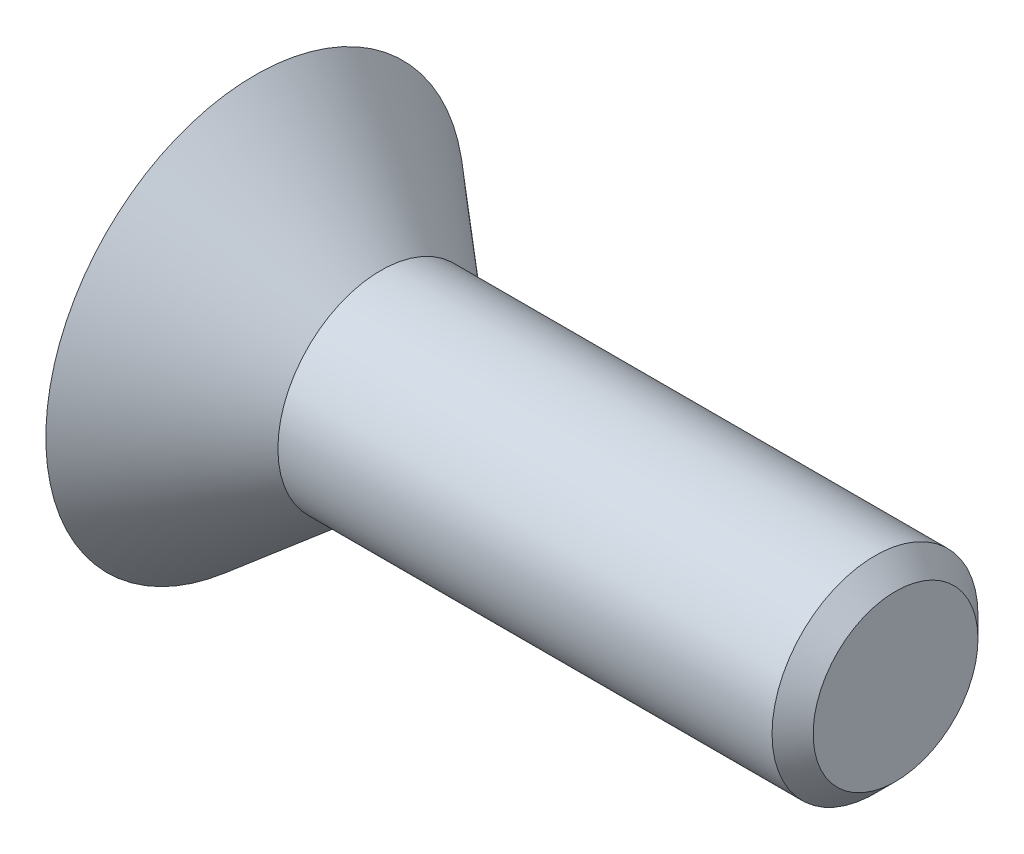
ISO-10303-21;
HEADER;
FILE_DESCRIPTION(('STEP AP214'),'2;1');
FILE_NAME('part.step','',(''),(''),'','','');
FILE_SCHEMA(('AUTOMOTIVE_DESIGN { 1 0 10303 214 1 1 1 1 }'));
ENDSEC;
DATA;
#1=APPLICATION_CONTEXT('core data for automotive mechanical design processes');
#2=APPLICATION_PROTOCOL_DEFINITION('international standard','automotive_design',2000,#1);
#3=PRODUCT_CONTEXT('',#1,'mechanical');
#4=PRODUCT('Part','Part','',(#3));
#5=PRODUCT_RELATED_PRODUCT_CATEGORY('part','',(#4));
#6=PRODUCT_DEFINITION_FORMATION('','',#4);
#7=PRODUCT_DEFINITION_CONTEXT('part definition',#1,'design');
#8=PRODUCT_DEFINITION('design','',#6,#7);
#9=PRODUCT_DEFINITION_SHAPE('','',#8);
#10=(LENGTH_UNIT() NAMED_UNIT(*) SI_UNIT(.MILLI.,.METRE.));
#11=(NAMED_UNIT(*) PLANE_ANGLE_UNIT() SI_UNIT($,.RADIAN.));
#12=(NAMED_UNIT(*) SI_UNIT($,.STERADIAN.) SOLID_ANGLE_UNIT());
#13=UNCERTAINTY_MEASURE_WITH_UNIT(LENGTH_MEASURE(1.E-05),#10,'distance_accuracy_value','');
#14=(GEOMETRIC_REPRESENTATION_CONTEXT(3) GLOBAL_UNCERTAINTY_ASSIGNED_CONTEXT((#13)) GLOBAL_UNIT_ASSIGNED_CONTEXT((#10,
#11,#12)) REPRESENTATION_CONTEXT('',''));
#15=CARTESIAN_POINT('',(0.,0.,0.));
#16=DIRECTION('',(0.,0.,1.));
#17=DIRECTION('',(1.,0.,0.));
#18=AXIS2_PLACEMENT_3D('',#15,#16,#17);
#19=CARTESIAN_POINT('',(498.7671,265.527536,0.));
#20=DIRECTION('',(-1.,0.,0.));
#21=DIRECTION('',(0.,0.,1.));
#22=AXIS2_PLACEMENT_3D('',#19,#20,#21);
#23=PLANE('',#22);
#24=CARTESIAN_POINT('',(498.7671,265.527536,0.));
#25=DIRECTION('',(1.,0.,0.));
#26=DIRECTION('',(0.,0.,-1.));
#27=AXIS2_PLACEMENT_3D('',#24,#25,#26);
#28=CIRCLE('',#27,8.06462699999999);
#29=CARTESIAN_POINT('',(498.7671,265.527536,-8.06462699999999));
#30=VERTEX_POINT('',#29);
#31=EDGE_CURVE('E11',#30,#30,#28,.T.);
#32=ORIENTED_EDGE('',*,*,#31,.F.);
#33=EDGE_LOOP('',(#32));
#34=FACE_BOUND('',#33,.T.);
#35=DIRECTION('',(0.,0.,1.));
#36=VECTOR('',#35,1.);
#37=CARTESIAN_POINT('',(498.7671,264.527536,0.));
#38=LINE('',#37,#36);
#39=CARTESIAN_POINT('',(498.7671,264.527536,1.));
#40=VERTEX_POINT('',#39);
#41=CARTESIAN_POINT('',(498.7671,264.527536,6.));
#42=VERTEX_POINT('',#41);
#43=EDGE_CURVE('E156',#40,#42,#38,.T.);
#44=ORIENTED_EDGE('',*,*,#43,.F.);
#45=DIRECTION('',(0.,-1.,0.));
#46=VECTOR('',#45,1.);
#47=CARTESIAN_POINT('',(498.7671,247.643935243763,1.));
#48=LINE('',#47,#46);
#49=CARTESIAN_POINT('',(498.7671,259.527536,1.));
#50=VERTEX_POINT('',#49);
#51=EDGE_CURVE('E47',#40,#50,#48,.T.);
#52=ORIENTED_EDGE('',*,*,#51,.T.);
#53=DIRECTION('',(0.,0.,1.));
#54=VECTOR('',#53,1.);
#55=CARTESIAN_POINT('',(498.7671,259.527536,0.));
#56=LINE('',#55,#54);
#57=CARTESIAN_POINT('',(498.7671,259.527536,-0.999999999999998));
#58=VERTEX_POINT('',#57);
#59=EDGE_CURVE('E183',#58,#50,#56,.T.);
#60=ORIENTED_EDGE('',*,*,#59,.F.);
#61=DIRECTION('',(0.,-1.,0.));
#62=VECTOR('',#61,1.);
#63=CARTESIAN_POINT('',(498.7671,247.643935243763,-0.999999999999997));
#64=LINE('',#63,#62);
#65=CARTESIAN_POINT('',(498.7671,264.527536,-0.999999999999999));
#66=VERTEX_POINT('',#65);
#67=EDGE_CURVE('E181',#66,#58,#64,.T.);
#68=ORIENTED_EDGE('',*,*,#67,.F.);
#69=DIRECTION('',(0.,0.,1.));
#70=VECTOR('',#69,1.);
#71=CARTESIAN_POINT('',(498.7671,264.527536,0.));
#72=LINE('',#71,#70);
#73=CARTESIAN_POINT('',(498.7671,264.527536,-6.));
#74=VERTEX_POINT('',#73);
#75=EDGE_CURVE('E130',#74,#66,#72,.T.);
#76=ORIENTED_EDGE('',*,*,#75,.F.);
#77=DIRECTION('',(0.,-1.,0.));
#78=VECTOR('',#77,1.);
#79=CARTESIAN_POINT('',(498.7671,247.643935243763,-6.));
#80=LINE('',#79,#78);
#81=CARTESIAN_POINT('',(498.7671,266.527536,-6.));
#82=VERTEX_POINT('',#81);
#83=EDGE_CURVE('E177',#82,#74,#80,.T.);
#84=ORIENTED_EDGE('',*,*,#83,.F.);
#85=DIRECTION('',(0.,0.,1.));
#86=VECTOR('',#85,1.);
#87=CARTESIAN_POINT('',(498.7671,266.527536,0.));
#88=LINE('',#87,#86);
#89=CARTESIAN_POINT('',(498.7671,266.527536,-0.999999999999999));
#90=VERTEX_POINT('',#89);
#91=EDGE_CURVE('E174',#82,#90,#88,.T.);
#92=ORIENTED_EDGE('',*,*,#91,.T.);
#93=DIRECTION('',(0.,-1.,0.));
#94=VECTOR('',#93,1.);
#95=CARTESIAN_POINT('',(498.7671,247.643935243763,-0.999999999999997));
#96=LINE('',#95,#94);
#97=CARTESIAN_POINT('',(498.7671,271.527536,-1.));
#98=VERTEX_POINT('',#97);
#99=EDGE_CURVE('E171',#98,#90,#96,.T.);
#100=ORIENTED_EDGE('',*,*,#99,.F.);
#101=DIRECTION('',(0.,0.,1.));
#102=VECTOR('',#101,1.);
#103=CARTESIAN_POINT('',(498.7671,271.527536,0.));
#104=LINE('',#103,#102);
#105=CARTESIAN_POINT('',(498.7671,271.527536,1.));
#106=VERTEX_POINT('',#105);
#107=EDGE_CURVE('E168',#98,#106,#104,.T.);
#108=ORIENTED_EDGE('',*,*,#107,.T.);
#109=DIRECTION('',(0.,-1.,0.));
#110=VECTOR('',#109,1.);
#111=CARTESIAN_POINT('',(498.7671,247.643935243763,1.));
#112=LINE('',#111,#110);
#113=CARTESIAN_POINT('',(498.7671,266.527536,1.));
#114=VERTEX_POINT('',#113);
#115=EDGE_CURVE('E165',#106,#114,#112,.T.);
#116=ORIENTED_EDGE('',*,*,#115,.T.);
#117=DIRECTION('',(0.,0.,1.));
#118=VECTOR('',#117,1.);
#119=CARTESIAN_POINT('',(498.7671,266.527536,0.));
#120=LINE('',#119,#118);
#121=CARTESIAN_POINT('',(498.7671,266.527536,6.));
#122=VERTEX_POINT('',#121);
#123=EDGE_CURVE('E162',#114,#122,#120,.T.);
#124=ORIENTED_EDGE('',*,*,#123,.T.);
#125=DIRECTION('',(0.,-1.,0.));
#126=VECTOR('',#125,1.);
#127=CARTESIAN_POINT('',(498.7671,247.643935243763,6.00000000000001));
#128=LINE('',#127,#126);
#129=EDGE_CURVE('E159',#122,#42,#128,.T.);
#130=ORIENTED_EDGE('',*,*,#129,.T.);
#131=EDGE_LOOP('',(#44,#52,#60,#68,#76,#84,#92,#100,#108,#116,#124,#130));
#132=FACE_BOUND('',#131,.T.);
#133=ADVANCED_FACE('F33',(#34,#132),#23,.T.);
#134=CARTESIAN_POINT('',(503.618754,265.527536,0.));
#135=DIRECTION('',(-1.,0.,0.));
#136=DIRECTION('',(0.,0.,1.));
#137=AXIS2_PLACEMENT_3D('',#134,#135,#136);
#138=CONICAL_SURFACE('',#137,3.969893,0.700992965111043);
#139=ORIENTED_EDGE('',*,*,#31,.T.);
#140=EDGE_LOOP('',(#139));
#141=FACE_BOUND('',#140,.T.);
#142=CARTESIAN_POINT('',(503.618754,265.527536,0.));
#143=DIRECTION('',(1.,0.,0.));
#144=DIRECTION('',(0.,0.,-1.));
#145=AXIS2_PLACEMENT_3D('',#142,#143,#144);
#146=CIRCLE('',#145,3.969893);
#147=CARTESIAN_POINT('',(503.618754,265.527536,-3.969893));
#148=VERTEX_POINT('',#147);
#149=EDGE_CURVE('E40',#148,#148,#146,.T.);
#150=ORIENTED_EDGE('',*,*,#149,.F.);
#151=EDGE_LOOP('',(#150));
#152=FACE_BOUND('',#151,.T.);
#153=ADVANCED_FACE('F214',(#141,#152),#138,.T.);
#154=CARTESIAN_POINT('',(523.461488,265.527536,0.));
#155=DIRECTION('',(1.,0.,0.));
#156=DIRECTION('',(0.,0.,-1.));
#157=AXIS2_PLACEMENT_3D('',#154,#155,#156);
#158=CYLINDRICAL_SURFACE('',#157,3.969893);
#159=ORIENTED_EDGE('',*,*,#149,.T.);
#160=EDGE_LOOP('',(#159));
#161=FACE_BOUND('',#160,.T.);
#162=CARTESIAN_POINT('',(522.668754,265.527536,0.));
#163=DIRECTION('',(1.,0.,0.));
#164=DIRECTION('',(0.,0.,-1.));
#165=AXIS2_PLACEMENT_3D('',#162,#163,#164);
#166=CIRCLE('',#165,3.969893);
#167=CARTESIAN_POINT('',(522.668754,265.527536,-3.969893));
#168=VERTEX_POINT('',#167);
#169=EDGE_CURVE('E206',#168,#168,#166,.T.);
#170=ORIENTED_EDGE('',*,*,#169,.F.);
#171=EDGE_LOOP('',(#170));
#172=FACE_BOUND('',#171,.T.);
#173=ADVANCED_FACE('F211',(#161,#172),#158,.T.);
#174=CARTESIAN_POINT('',(523.461488,265.527536,0.));
#175=DIRECTION('',(-1.,0.,0.));
#176=DIRECTION('',(0.,0.,1.));
#177=AXIS2_PLACEMENT_3D('',#174,#175,#176);
#178=CONICAL_SURFACE('',#177,3.17766700000005,0.785077650587939);
#179=ORIENTED_EDGE('',*,*,#169,.T.);
#180=EDGE_LOOP('',(#179));
#181=FACE_BOUND('',#180,.T.);
#182=CARTESIAN_POINT('',(523.461488,265.527536,0.));
#183=DIRECTION('',(1.,0.,0.));
#184=DIRECTION('',(0.,0.,-1.));
#185=AXIS2_PLACEMENT_3D('',#182,#183,#184);
#186=CIRCLE('',#185,3.17766700000005);
#187=CARTESIAN_POINT('',(523.461488,265.527536,-3.17766700000005));
#188=VERTEX_POINT('',#187);
#189=EDGE_CURVE('E186',#188,#188,#186,.T.);
#190=ORIENTED_EDGE('',*,*,#189,.F.);
#191=EDGE_LOOP('',(#190));
#192=FACE_BOUND('',#191,.T.);
#193=ADVANCED_FACE('F221',(#181,#192),#178,.T.);
#194=CARTESIAN_POINT('',(523.461488,268.705203,0.));
#195=DIRECTION('',(1.,0.,0.));
#196=DIRECTION('',(0.,0.,-1.));
#197=AXIS2_PLACEMENT_3D('',#194,#195,#196);
#198=PLANE('',#197);
#199=ORIENTED_EDGE('',*,*,#189,.T.);
#200=EDGE_LOOP('',(#199));
#201=FACE_BOUND('',#200,.T.);
#202=ADVANCED_FACE('F227',(#201),#198,.T.);
#203=CARTESIAN_POINT('',(500.7671,247.643935243763,1.));
#204=DIRECTION('',(0.,0.,-1.));
#205=DIRECTION('',(0.,1.,0.));
#206=AXIS2_PLACEMENT_3D('',#203,#204,#205);
#207=PLANE('',#206);
#208=ORIENTED_EDGE('',*,*,#51,.F.);
#209=DIRECTION('',(-1.,0.,0.));
#210=VECTOR('',#209,1.);
#211=CARTESIAN_POINT('',(500.7671,264.527536,1.));
#212=LINE('',#211,#210);
#213=CARTESIAN_POINT('',(500.7671,264.527536,1.));
#214=VERTEX_POINT('',#213);
#215=EDGE_CURVE('E95',#214,#40,#212,.T.);
#216=ORIENTED_EDGE('',*,*,#215,.F.);
#217=DIRECTION('',(0.,-1.,0.));
#218=VECTOR('',#217,1.);
#219=CARTESIAN_POINT('',(500.7671,247.643935243763,1.));
#220=LINE('',#219,#218);
#221=CARTESIAN_POINT('',(500.7671,259.527536,1.));
#222=VERTEX_POINT('',#221);
#223=EDGE_CURVE('E53',#214,#222,#220,.T.);
#224=ORIENTED_EDGE('',*,*,#223,.T.);
#225=DIRECTION('',(-1.,0.,0.));
#226=VECTOR('',#225,1.);
#227=CARTESIAN_POINT('',(500.7671,259.527536,1.));
#228=LINE('',#227,#226);
#229=EDGE_CURVE('E91',#222,#50,#228,.T.);
#230=ORIENTED_EDGE('',*,*,#229,.T.);
#231=EDGE_LOOP('',(#208,#216,#224,#230));
#232=FACE_BOUND('',#231,.T.);
#233=ADVANCED_FACE('F231',(#232),#207,.T.);
#234=CARTESIAN_POINT('',(500.7671,259.527536,0.));
#235=DIRECTION('',(0.,-1.,0.));
#236=DIRECTION('',(0.,0.,-1.));
#237=AXIS2_PLACEMENT_3D('',#234,#235,#236);
#238=PLANE('',#237);
#239=ORIENTED_EDGE('',*,*,#59,.T.);
#240=ORIENTED_EDGE('',*,*,#229,.F.);
#241=DIRECTION('',(0.,0.,1.));
#242=VECTOR('',#241,1.);
#243=CARTESIAN_POINT('',(500.7671,259.527536,0.));
#244=LINE('',#243,#242);
#245=CARTESIAN_POINT('',(500.7671,259.527536,-0.999999999999998));
#246=VERTEX_POINT('',#245);
#247=EDGE_CURVE('E143',#246,#222,#244,.T.);
#248=ORIENTED_EDGE('',*,*,#247,.F.);
#249=DIRECTION('',(-1.,0.,0.));
#250=VECTOR('',#249,1.);
#251=CARTESIAN_POINT('',(500.7671,259.527536,-0.999999999999998));
#252=LINE('',#251,#250);
#253=EDGE_CURVE('E134',#246,#58,#252,.T.);
#254=ORIENTED_EDGE('',*,*,#253,.T.);
#255=EDGE_LOOP('',(#239,#240,#248,#254));
#256=FACE_BOUND('',#255,.T.);
#257=ADVANCED_FACE('F235',(#256),#238,.F.);
#258=CARTESIAN_POINT('',(500.7671,247.643935243763,-0.999999999999997));
#259=DIRECTION('',(0.,0.,-1.));
#260=DIRECTION('',(0.,1.,0.));
#261=AXIS2_PLACEMENT_3D('',#258,#259,#260);
#262=PLANE('',#261);
#263=ORIENTED_EDGE('',*,*,#67,.T.);
#264=ORIENTED_EDGE('',*,*,#253,.F.);
#265=DIRECTION('',(0.,-1.,0.));
#266=VECTOR('',#265,1.);
#267=CARTESIAN_POINT('',(500.7671,247.643935243763,-0.999999999999997));
#268=LINE('',#267,#266);
#269=CARTESIAN_POINT('',(500.7671,264.527536,-0.999999999999999));
#270=VERTEX_POINT('',#269);
#271=EDGE_CURVE('E138',#270,#246,#268,.T.);
#272=ORIENTED_EDGE('',*,*,#271,.F.);
#273=DIRECTION('',(-1.,0.,0.));
#274=VECTOR('',#273,1.);
#275=CARTESIAN_POINT('',(500.7671,264.527536,-0.999999999999999));
#276=LINE('',#275,#274);
#277=EDGE_CURVE('E123',#270,#66,#276,.T.);
#278=ORIENTED_EDGE('',*,*,#277,.T.);
#279=EDGE_LOOP('',(#263,#264,#272,#278));
#280=FACE_BOUND('',#279,.T.);
#281=ADVANCED_FACE('F139',(#280),#262,.F.);
#282=CARTESIAN_POINT('',(500.7671,264.527536,0.));
#283=DIRECTION('',(0.,-1.,0.));
#284=DIRECTION('',(0.,0.,-1.));
#285=AXIS2_PLACEMENT_3D('',#282,#283,#284);
#286=PLANE('',#285);
#287=ORIENTED_EDGE('',*,*,#75,.T.);
#288=ORIENTED_EDGE('',*,*,#277,.F.);
#289=DIRECTION('',(0.,0.,1.));
#290=VECTOR('',#289,1.);
#291=CARTESIAN_POINT('',(500.7671,264.527536,0.));
#292=LINE('',#291,#290);
#293=CARTESIAN_POINT('',(500.7671,264.527536,-6.));
#294=VERTEX_POINT('',#293);
#295=EDGE_CURVE('E127',#294,#270,#292,.T.);
#296=ORIENTED_EDGE('',*,*,#295,.F.);
#297=DIRECTION('',(-1.,0.,0.));
#298=VECTOR('',#297,1.);
#299=CARTESIAN_POINT('',(500.7671,264.527536,-6.));
#300=LINE('',#299,#298);
#301=EDGE_CURVE('E135',#294,#74,#300,.T.);
#302=ORIENTED_EDGE('',*,*,#301,.T.);
#303=EDGE_LOOP('',(#287,#288,#296,#302));
#304=FACE_BOUND('',#303,.T.);
#305=ADVANCED_FACE('F125',(#304),#286,.F.);
#306=CARTESIAN_POINT('',(500.7671,247.643935243763,-6.));
#307=DIRECTION('',(0.,0.,-1.));
#308=DIRECTION('',(-1.,0.,0.));
#309=AXIS2_PLACEMENT_3D('',#306,#307,#308);
#310=PLANE('',#309);
#311=ORIENTED_EDGE('',*,*,#83,.T.);
#312=ORIENTED_EDGE('',*,*,#301,.F.);
#313=DIRECTION('',(0.,-1.,0.));
#314=VECTOR('',#313,1.);
#315=CARTESIAN_POINT('',(500.7671,247.643935243763,-6.));
#316=LINE('',#315,#314);
#317=CARTESIAN_POINT('',(500.7671,266.527536,-6.));
#318=VERTEX_POINT('',#317);
#319=EDGE_CURVE('E148',#318,#294,#316,.T.);
#320=ORIENTED_EDGE('',*,*,#319,.F.);
#321=DIRECTION('',(-1.,0.,0.));
#322=VECTOR('',#321,1.);
#323=CARTESIAN_POINT('',(500.7671,266.527536,-6.));
#324=LINE('',#323,#322);
#325=EDGE_CURVE('E189',#318,#82,#324,.T.);
#326=ORIENTED_EDGE('',*,*,#325,.T.);
#327=EDGE_LOOP('',(#311,#312,#320,#326));
#328=FACE_BOUND('',#327,.T.);
#329=ADVANCED_FACE('F263',(#328),#310,.F.);
#330=CARTESIAN_POINT('',(500.7671,266.527536,0.));
#331=DIRECTION('',(0.,-1.,0.));
#332=DIRECTION('',(0.,0.,-1.));
#333=AXIS2_PLACEMENT_3D('',#330,#331,#332);
#334=PLANE('',#333);
#335=ORIENTED_EDGE('',*,*,#91,.F.);
#336=ORIENTED_EDGE('',*,*,#325,.F.);
#337=DIRECTION('',(0.,0.,1.));
#338=VECTOR('',#337,1.);
#339=CARTESIAN_POINT('',(500.7671,266.527536,0.));
#340=LINE('',#339,#338);
#341=CARTESIAN_POINT('',(500.7671,266.527536,-0.999999999999999));
#342=VERTEX_POINT('',#341);
#343=EDGE_CURVE('E150',#318,#342,#340,.T.);
#344=ORIENTED_EDGE('',*,*,#343,.T.);
#345=DIRECTION('',(-1.,0.,0.));
#346=VECTOR('',#345,1.);
#347=CARTESIAN_POINT('',(500.7671,266.527536,-0.999999999999999));
#348=LINE('',#347,#346);
#349=EDGE_CURVE('E191',#342,#90,#348,.T.);
#350=ORIENTED_EDGE('',*,*,#349,.T.);
#351=EDGE_LOOP('',(#335,#336,#344,#350));
#352=FACE_BOUND('',#351,.T.);
#353=ADVANCED_FACE('F259',(#352),#334,.T.);
#354=CARTESIAN_POINT('',(500.7671,247.643935243763,-0.999999999999997));
#355=DIRECTION('',(0.,0.,-1.));
#356=DIRECTION('',(0.,1.,0.));
#357=AXIS2_PLACEMENT_3D('',#354,#355,#356);
#358=PLANE('',#357);
#359=ORIENTED_EDGE('',*,*,#99,.T.);
#360=ORIENTED_EDGE('',*,*,#349,.F.);
#361=DIRECTION('',(0.,-1.,0.));
#362=VECTOR('',#361,1.);
#363=CARTESIAN_POINT('',(500.7671,247.643935243763,-0.999999999999997));
#364=LINE('',#363,#362);
#365=CARTESIAN_POINT('',(500.7671,271.527536,-1.));
#366=VERTEX_POINT('',#365);
#367=EDGE_CURVE('E411',#366,#342,#364,.T.);
#368=ORIENTED_EDGE('',*,*,#367,.F.);
#369=DIRECTION('',(-1.,0.,0.));
#370=VECTOR('',#369,1.);
#371=CARTESIAN_POINT('',(500.7671,271.527536,-1.));
#372=LINE('',#371,#370);
#373=EDGE_CURVE('E193',#366,#98,#372,.T.);
#374=ORIENTED_EDGE('',*,*,#373,.T.);
#375=EDGE_LOOP('',(#359,#360,#368,#374));
#376=FACE_BOUND('',#375,.T.);
#377=ADVANCED_FACE('F255',(#376),#358,.F.);
#378=CARTESIAN_POINT('',(500.7671,271.527536,0.));
#379=DIRECTION('',(0.,-1.,0.));
#380=DIRECTION('',(0.,0.,-1.));
#381=AXIS2_PLACEMENT_3D('',#378,#379,#380);
#382=PLANE('',#381);
#383=ORIENTED_EDGE('',*,*,#107,.F.);
#384=ORIENTED_EDGE('',*,*,#373,.F.);
#385=DIRECTION('',(0.,0.,1.));
#386=VECTOR('',#385,1.);
#387=CARTESIAN_POINT('',(500.7671,271.527536,0.));
#388=LINE('',#387,#386);
#389=CARTESIAN_POINT('',(500.7671,271.527536,1.));
#390=VERTEX_POINT('',#389);
#391=EDGE_CURVE('E409',#366,#390,#388,.T.);
#392=ORIENTED_EDGE('',*,*,#391,.T.);
#393=DIRECTION('',(-1.,0.,0.));
#394=VECTOR('',#393,1.);
#395=CARTESIAN_POINT('',(500.7671,271.527536,1.));
#396=LINE('',#395,#394);
#397=EDGE_CURVE('E195',#390,#106,#396,.T.);
#398=ORIENTED_EDGE('',*,*,#397,.T.);
#399=EDGE_LOOP('',(#383,#384,#392,#398));
#400=FACE_BOUND('',#399,.T.);
#401=ADVANCED_FACE('F251',(#400),#382,.T.);
#402=CARTESIAN_POINT('',(500.7671,247.643935243763,1.));
#403=DIRECTION('',(0.,0.,-1.));
#404=DIRECTION('',(0.,1.,0.));
#405=AXIS2_PLACEMENT_3D('',#402,#403,#404);
#406=PLANE('',#405);
#407=ORIENTED_EDGE('',*,*,#115,.F.);
#408=ORIENTED_EDGE('',*,*,#397,.F.);
#409=DIRECTION('',(0.,-1.,0.));
#410=VECTOR('',#409,1.);
#411=CARTESIAN_POINT('',(500.7671,247.643935243763,1.));
#412=LINE('',#411,#410);
#413=CARTESIAN_POINT('',(500.7671,266.527536,1.));
#414=VERTEX_POINT('',#413);
#415=EDGE_CURVE('E407',#390,#414,#412,.T.);
#416=ORIENTED_EDGE('',*,*,#415,.T.);
#417=DIRECTION('',(-1.,0.,0.));
#418=VECTOR('',#417,1.);
#419=CARTESIAN_POINT('',(500.7671,266.527536,1.));
#420=LINE('',#419,#418);
#421=EDGE_CURVE('E197',#414,#114,#420,.T.);
#422=ORIENTED_EDGE('',*,*,#421,.T.);
#423=EDGE_LOOP('',(#407,#408,#416,#422));
#424=FACE_BOUND('',#423,.T.);
#425=ADVANCED_FACE('F247',(#424),#406,.T.);
#426=CARTESIAN_POINT('',(500.7671,266.527536,0.));
#427=DIRECTION('',(0.,-1.,0.));
#428=DIRECTION('',(0.,0.,-1.));
#429=AXIS2_PLACEMENT_3D('',#426,#427,#428);
#430=PLANE('',#429);
#431=ORIENTED_EDGE('',*,*,#123,.F.);
#432=ORIENTED_EDGE('',*,*,#421,.F.);
#433=DIRECTION('',(0.,0.,1.));
#434=VECTOR('',#433,1.);
#435=CARTESIAN_POINT('',(500.7671,266.527536,0.));
#436=LINE('',#435,#434);
#437=CARTESIAN_POINT('',(500.7671,266.527536,6.));
#438=VERTEX_POINT('',#437);
#439=EDGE_CURVE('E402',#414,#438,#436,.T.);
#440=ORIENTED_EDGE('',*,*,#439,.T.);
#441=DIRECTION('',(-1.,0.,0.));
#442=VECTOR('',#441,1.);
#443=CARTESIAN_POINT('',(500.7671,266.527536,6.));
#444=LINE('',#443,#442);
#445=EDGE_CURVE('E199',#438,#122,#444,.T.);
#446=ORIENTED_EDGE('',*,*,#445,.T.);
#447=EDGE_LOOP('',(#431,#432,#440,#446));
#448=FACE_BOUND('',#447,.T.);
#449=ADVANCED_FACE('F243',(#448),#430,.T.);
#450=CARTESIAN_POINT('',(500.7671,247.643935243763,6.00000000000001));
#451=DIRECTION('',(0.,0.,-1.));
#452=DIRECTION('',(0.,1.,0.));
#453=AXIS2_PLACEMENT_3D('',#450,#451,#452);
#454=PLANE('',#453);
#455=ORIENTED_EDGE('',*,*,#129,.F.);
#456=ORIENTED_EDGE('',*,*,#445,.F.);
#457=DIRECTION('',(0.,-1.,0.));
#458=VECTOR('',#457,1.);
#459=CARTESIAN_POINT('',(500.7671,247.643935243763,6.00000000000001));
#460=LINE('',#459,#458);
#461=CARTESIAN_POINT('',(500.7671,264.527536,6.));
#462=VERTEX_POINT('',#461);
#463=EDGE_CURVE('E400',#438,#462,#460,.T.);
#464=ORIENTED_EDGE('',*,*,#463,.T.);
#465=DIRECTION('',(-1.,0.,0.));
#466=VECTOR('',#465,1.);
#467=CARTESIAN_POINT('',(500.7671,264.527536,6.));
#468=LINE('',#467,#466);
#469=EDGE_CURVE('E201',#462,#42,#468,.T.);
#470=ORIENTED_EDGE('',*,*,#469,.T.);
#471=EDGE_LOOP('',(#455,#456,#464,#470));
#472=FACE_BOUND('',#471,.T.);
#473=ADVANCED_FACE('F239',(#472),#454,.T.);
#474=CARTESIAN_POINT('',(500.7671,264.527536,0.));
#475=DIRECTION('',(0.,-1.,0.));
#476=DIRECTION('',(0.,0.,-1.));
#477=AXIS2_PLACEMENT_3D('',#474,#475,#476);
#478=PLANE('',#477);
#479=ORIENTED_EDGE('',*,*,#43,.T.);
#480=ORIENTED_EDGE('',*,*,#469,.F.);
#481=DIRECTION('',(0.,0.,1.));
#482=VECTOR('',#481,1.);
#483=CARTESIAN_POINT('',(500.7671,264.527536,0.));
#484=LINE('',#483,#482);
#485=EDGE_CURVE('E398',#214,#462,#484,.T.);
#486=ORIENTED_EDGE('',*,*,#485,.F.);
#487=ORIENTED_EDGE('',*,*,#215,.T.);
#488=EDGE_LOOP('',(#479,#480,#486,#487));
#489=FACE_BOUND('',#488,.T.);
#490=ADVANCED_FACE('F236',(#489),#478,.F.);
#491=CARTESIAN_POINT('',(500.7671,247.643935243763,0.));
#492=DIRECTION('',(-1.,0.,0.));
#493=DIRECTION('',(0.,0.,1.));
#494=AXIS2_PLACEMENT_3D('',#491,#492,#493);
#495=PLANE('',#494);
#496=ORIENTED_EDGE('',*,*,#223,.F.);
#497=ORIENTED_EDGE('',*,*,#485,.T.);
#498=ORIENTED_EDGE('',*,*,#463,.F.);
#499=ORIENTED_EDGE('',*,*,#439,.F.);
#500=ORIENTED_EDGE('',*,*,#415,.F.);
#501=ORIENTED_EDGE('',*,*,#391,.F.);
#502=ORIENTED_EDGE('',*,*,#367,.T.);
#503=ORIENTED_EDGE('',*,*,#343,.F.);
#504=ORIENTED_EDGE('',*,*,#319,.T.);
#505=ORIENTED_EDGE('',*,*,#295,.T.);
#506=ORIENTED_EDGE('',*,*,#271,.T.);
#507=ORIENTED_EDGE('',*,*,#247,.T.);
#508=EDGE_LOOP('',(#496,#497,#498,#499,#500,#501,#502,#503,#504,#505,#506,#507));
#509=FACE_BOUND('',#508,.T.);
#510=ADVANCED_FACE('F145',(#509),#495,.T.);
#511=CLOSED_SHELL('',(#133,#153,#173,#193,#202,#233,#257,#281,#305,#329,#353,#377,#401,#425,
#449,#473,#490,#510));
#512=MANIFOLD_SOLID_BREP('B2',#511);
#513=ADVANCED_BREP_SHAPE_REPRESENTATION('',(#18,#512),#14);
#514=SHAPE_DEFINITION_REPRESENTATION(#9,#513);
ENDSEC;
END-ISO-10303-21;
